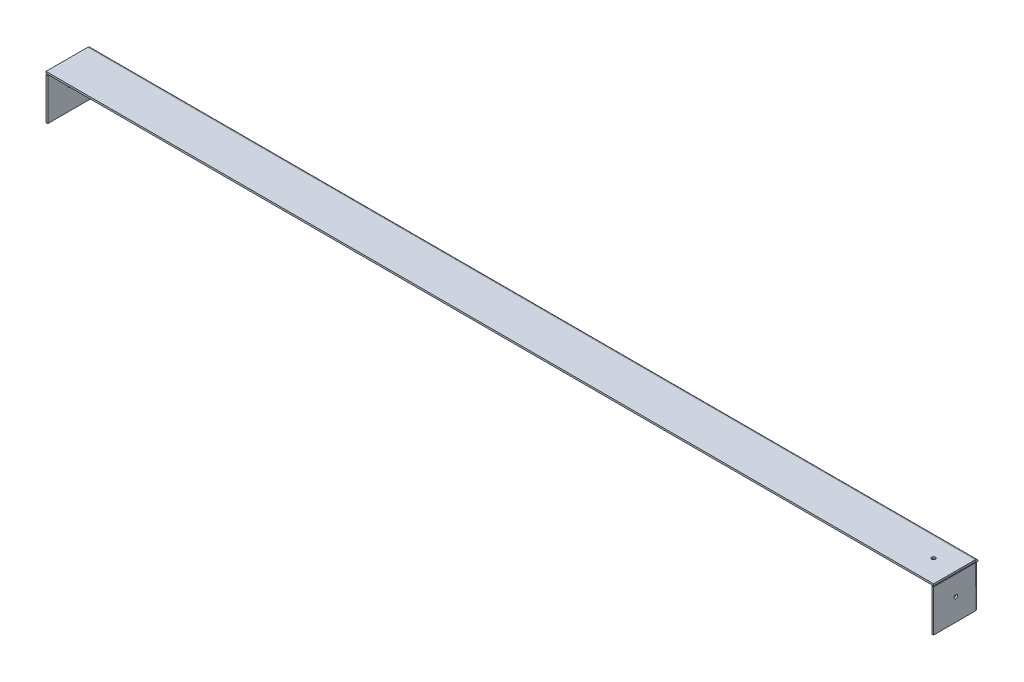
ISO-10303-21;
HEADER;
FILE_DESCRIPTION(('STEP AP214'),'2;1');
FILE_NAME('part.step','',(''),(''),'','','');
FILE_SCHEMA(('AUTOMOTIVE_DESIGN { 1 0 10303 214 1 1 1 1 }'));
ENDSEC;
DATA;
#1=APPLICATION_CONTEXT('core data for automotive mechanical design processes');
#2=APPLICATION_PROTOCOL_DEFINITION('international standard','automotive_design',2000,#1);
#3=PRODUCT_CONTEXT('',#1,'mechanical');
#4=PRODUCT('Part','Part','',(#3));
#5=PRODUCT_RELATED_PRODUCT_CATEGORY('part','',(#4));
#6=PRODUCT_DEFINITION_FORMATION('','',#4);
#7=PRODUCT_DEFINITION_CONTEXT('part definition',#1,'design');
#8=PRODUCT_DEFINITION('design','',#6,#7);
#9=PRODUCT_DEFINITION_SHAPE('','',#8);
#10=(LENGTH_UNIT() NAMED_UNIT(*) SI_UNIT(.MILLI.,.METRE.));
#11=(NAMED_UNIT(*) PLANE_ANGLE_UNIT() SI_UNIT($,.RADIAN.));
#12=(NAMED_UNIT(*) SI_UNIT($,.STERADIAN.) SOLID_ANGLE_UNIT());
#13=UNCERTAINTY_MEASURE_WITH_UNIT(LENGTH_MEASURE(1.E-05),#10,'distance_accuracy_value','');
#14=(GEOMETRIC_REPRESENTATION_CONTEXT(3) GLOBAL_UNCERTAINTY_ASSIGNED_CONTEXT((#13)) GLOBAL_UNIT_ASSIGNED_CONTEXT((#10,
#11,#12)) REPRESENTATION_CONTEXT('',''));
#15=CARTESIAN_POINT('',(0.,0.,0.));
#16=DIRECTION('',(0.,0.,1.));
#17=DIRECTION('',(1.,0.,0.));
#18=AXIS2_PLACEMENT_3D('',#15,#16,#17);
#19=CARTESIAN_POINT('',(500.,22.,2.));
#20=DIRECTION('',(0.,-1.,0.));
#21=DIRECTION('',(0.,0.,-1.));
#22=AXIS2_PLACEMENT_3D('',#19,#20,#21);
#23=PLANE('',#22);
#24=DIRECTION('',(-1.,0.,0.));
#25=VECTOR('',#24,1.);
#26=CARTESIAN_POINT('',(500.,22.,2.));
#27=LINE('',#26,#25);
#28=CARTESIAN_POINT('',(500.,22.,2.));
#29=VERTEX_POINT('',#28);
#30=CARTESIAN_POINT('',(499.828427124746,22.,2.));
#31=VERTEX_POINT('',#30);
#32=EDGE_CURVE('E345',#29,#31,#27,.T.);
#33=ORIENTED_EDGE('',*,*,#32,.T.);
#34=CARTESIAN_POINT('',(497.,22.,3.00000000000001));
#35=DIRECTION('',(0.,1.,0.));
#36=DIRECTION('',(0.,0.,1.));
#37=AXIS2_PLACEMENT_3D('',#34,#35,#36);
#38=CIRCLE('',#37,3.);
#39=CARTESIAN_POINT('',(497.,22.,0.));
#40=VERTEX_POINT('',#39);
#41=EDGE_CURVE('E13',#31,#40,#38,.T.);
#42=ORIENTED_EDGE('',*,*,#41,.T.);
#43=DIRECTION('',(-1.,0.,0.));
#44=VECTOR('',#43,1.);
#45=CARTESIAN_POINT('',(-500.,22.,0.));
#46=LINE('',#45,#44);
#47=CARTESIAN_POINT('',(500.,22.,0.));
#48=VERTEX_POINT('',#47);
#49=EDGE_CURVE('E347',#48,#40,#46,.T.);
#50=ORIENTED_EDGE('',*,*,#49,.F.);
#51=DIRECTION('',(0.,0.,-1.));
#52=VECTOR('',#51,1.);
#53=CARTESIAN_POINT('',(500.,22.,1.99999999999997));
#54=LINE('',#53,#52);
#55=EDGE_CURVE('E527',#29,#48,#54,.T.);
#56=ORIENTED_EDGE('',*,*,#55,.F.);
#57=EDGE_LOOP('',(#33,#42,#50,#56));
#58=FACE_BOUND('',#57,.T.);
#59=ADVANCED_FACE('F97',(#58),#23,.T.);
#60=CARTESIAN_POINT('',(0.,0.,2.));
#61=DIRECTION('',(0.,0.,1.));
#62=DIRECTION('',(1.,0.,0.));
#63=AXIS2_PLACEMENT_3D('',#60,#61,#62);
#64=PLANE('',#63);
#65=CARTESIAN_POINT('',(-481.5,0.,2.));
#66=DIRECTION('',(0.,0.,1.));
#67=DIRECTION('',(1.,0.,0.));
#68=AXIS2_PLACEMENT_3D('',#65,#66,#67);
#69=CIRCLE('',#68,4.25);
#70=CARTESIAN_POINT('',(-481.5,4.25,2.));
#71=VERTEX_POINT('',#70);
#72=CARTESIAN_POINT('',(-481.5,-4.25,2.));
#73=VERTEX_POINT('',#72);
#74=EDGE_CURVE('E404',#71,#73,#69,.T.);
#75=ORIENTED_EDGE('',*,*,#74,.F.);
#76=DIRECTION('',(-1.,0.,0.));
#77=VECTOR('',#76,1.);
#78=CARTESIAN_POINT('',(-481.5,4.25,2.));
#79=LINE('',#78,#77);
#80=CARTESIAN_POINT('',(-468.5,4.25,2.));
#81=VERTEX_POINT('',#80);
#82=EDGE_CURVE('E409',#81,#71,#79,.T.);
#83=ORIENTED_EDGE('',*,*,#82,.F.);
#84=CARTESIAN_POINT('',(-468.5,0.,2.));
#85=DIRECTION('',(0.,0.,1.));
#86=DIRECTION('',(1.,0.,0.));
#87=AXIS2_PLACEMENT_3D('',#84,#85,#86);
#88=CIRCLE('',#87,4.25);
#89=CARTESIAN_POINT('',(-468.5,-4.25,2.));
#90=VERTEX_POINT('',#89);
#91=EDGE_CURVE('E423',#90,#81,#88,.T.);
#92=ORIENTED_EDGE('',*,*,#91,.F.);
#93=DIRECTION('',(1.,0.,0.));
#94=VECTOR('',#93,1.);
#95=CARTESIAN_POINT('',(-481.5,-4.25,2.));
#96=LINE('',#95,#94);
#97=EDGE_CURVE('E420',#73,#90,#96,.T.);
#98=ORIENTED_EDGE('',*,*,#97,.F.);
#99=EDGE_LOOP('',(#75,#83,#92,#98));
#100=FACE_BOUND('',#99,.T.);
#101=CARTESIAN_POINT('',(468.5,0.,2.));
#102=DIRECTION('',(0.,0.,1.));
#103=DIRECTION('',(1.,0.,0.));
#104=AXIS2_PLACEMENT_3D('',#101,#102,#103);
#105=CIRCLE('',#104,4.25);
#106=CARTESIAN_POINT('',(468.5,4.25000000000001,2.));
#107=VERTEX_POINT('',#106);
#108=CARTESIAN_POINT('',(468.5,-4.24999999999999,2.));
#109=VERTEX_POINT('',#108);
#110=EDGE_CURVE('E430',#107,#109,#105,.T.);
#111=ORIENTED_EDGE('',*,*,#110,.F.);
#112=DIRECTION('',(-1.,0.,0.));
#113=VECTOR('',#112,1.);
#114=CARTESIAN_POINT('',(468.5,4.25000000000001,2.));
#115=LINE('',#114,#113);
#116=CARTESIAN_POINT('',(481.5,4.25000000000001,2.));
#117=VERTEX_POINT('',#116);
#118=EDGE_CURVE('E441',#117,#107,#115,.T.);
#119=ORIENTED_EDGE('',*,*,#118,.F.);
#120=CARTESIAN_POINT('',(481.5,0.,2.));
#121=DIRECTION('',(0.,0.,1.));
#122=DIRECTION('',(1.,0.,0.));
#123=AXIS2_PLACEMENT_3D('',#120,#121,#122);
#124=CIRCLE('',#123,4.25);
#125=CARTESIAN_POINT('',(481.5,-4.24999999999999,2.));
#126=VERTEX_POINT('',#125);
#127=EDGE_CURVE('E455',#126,#117,#124,.T.);
#128=ORIENTED_EDGE('',*,*,#127,.F.);
#129=DIRECTION('',(1.,0.,0.));
#130=VECTOR('',#129,1.);
#131=CARTESIAN_POINT('',(468.5,-4.24999999999999,2.));
#132=LINE('',#131,#130);
#133=EDGE_CURVE('E452',#109,#126,#132,.T.);
#134=ORIENTED_EDGE('',*,*,#133,.F.);
#135=EDGE_LOOP('',(#111,#119,#128,#134));
#136=FACE_BOUND('',#135,.T.);
#137=DIRECTION('',(1.,0.,0.));
#138=VECTOR('',#137,1.);
#139=CARTESIAN_POINT('',(-500.,-25.,2.));
#140=LINE('',#139,#138);
#141=CARTESIAN_POINT('',(-497.,-25.,2.00000000000001));
#142=VERTEX_POINT('',#141);
#143=CARTESIAN_POINT('',(497.,-25.,2.00000000000001));
#144=VERTEX_POINT('',#143);
#145=EDGE_CURVE('E106',#142,#144,#140,.T.);
#146=ORIENTED_EDGE('',*,*,#145,.T.);
#147=DIRECTION('',(0.,1.,0.));
#148=VECTOR('',#147,1.);
#149=CARTESIAN_POINT('',(497.,22.,2.00000000000001));
#150=LINE('',#149,#148);
#151=CARTESIAN_POINT('',(497.,22.,2.00000000000001));
#152=VERTEX_POINT('',#151);
#153=EDGE_CURVE('E339',#152,#144,#150,.F.);
#154=ORIENTED_EDGE('',*,*,#153,.F.);
#155=DIRECTION('',(-1.,0.,0.));
#156=VECTOR('',#155,1.);
#157=CARTESIAN_POINT('',(-500.,22.,1.99999999999997));
#158=LINE('',#157,#156);
#159=CARTESIAN_POINT('',(-497.,22.,1.99999999999997));
#160=VERTEX_POINT('',#159);
#161=EDGE_CURVE('E524',#160,#152,#158,.F.);
#162=ORIENTED_EDGE('',*,*,#161,.F.);
#163=DIRECTION('',(0.,-1.,0.));
#164=VECTOR('',#163,1.);
#165=CARTESIAN_POINT('',(-497.,-25.,2.00000000000001));
#166=LINE('',#165,#164);
#167=EDGE_CURVE('E398',#142,#160,#166,.F.);
#168=ORIENTED_EDGE('',*,*,#167,.F.);
#169=EDGE_LOOP('',(#146,#154,#162,#168));
#170=FACE_BOUND('',#169,.T.);
#171=ADVANCED_FACE('F590',(#100,#136,#170),#64,.T.);
#172=CARTESIAN_POINT('',(0.,0.,0.));
#173=DIRECTION('',(0.,0.,1.));
#174=DIRECTION('',(1.,0.,0.));
#175=AXIS2_PLACEMENT_3D('',#172,#173,#174);
#176=PLANE('',#175);
#177=DIRECTION('',(-1.,0.,0.));
#178=VECTOR('',#177,1.);
#179=CARTESIAN_POINT('',(-481.5,4.25,0.));
#180=LINE('',#179,#178);
#181=CARTESIAN_POINT('',(-468.5,4.25,0.));
#182=VERTEX_POINT('',#181);
#183=CARTESIAN_POINT('',(-481.5,4.25,0.));
#184=VERTEX_POINT('',#183);
#185=EDGE_CURVE('E415',#182,#184,#180,.T.);
#186=ORIENTED_EDGE('',*,*,#185,.T.);
#187=CARTESIAN_POINT('',(-481.5,0.,0.));
#188=DIRECTION('',(0.,0.,1.));
#189=DIRECTION('',(1.,0.,0.));
#190=AXIS2_PLACEMENT_3D('',#187,#188,#189);
#191=CIRCLE('',#190,4.25);
#192=CARTESIAN_POINT('',(-481.5,-4.25,0.));
#193=VERTEX_POINT('',#192);
#194=EDGE_CURVE('E405',#184,#193,#191,.T.);
#195=ORIENTED_EDGE('',*,*,#194,.T.);
#196=DIRECTION('',(1.,0.,0.));
#197=VECTOR('',#196,1.);
#198=CARTESIAN_POINT('',(-481.5,-4.25,0.));
#199=LINE('',#198,#197);
#200=CARTESIAN_POINT('',(-468.5,-4.25,0.));
#201=VERTEX_POINT('',#200);
#202=EDGE_CURVE('E408',#193,#201,#199,.T.);
#203=ORIENTED_EDGE('',*,*,#202,.T.);
#204=CARTESIAN_POINT('',(-468.5,0.,0.));
#205=DIRECTION('',(0.,0.,1.));
#206=DIRECTION('',(1.,0.,0.));
#207=AXIS2_PLACEMENT_3D('',#204,#205,#206);
#208=CIRCLE('',#207,4.25);
#209=EDGE_CURVE('E412',#201,#182,#208,.T.);
#210=ORIENTED_EDGE('',*,*,#209,.T.);
#211=EDGE_LOOP('',(#186,#195,#203,#210));
#212=FACE_BOUND('',#211,.T.);
#213=DIRECTION('',(-1.,0.,0.));
#214=VECTOR('',#213,1.);
#215=CARTESIAN_POINT('',(468.5,4.25000000000001,0.));
#216=LINE('',#215,#214);
#217=CARTESIAN_POINT('',(481.5,4.25000000000001,0.));
#218=VERTEX_POINT('',#217);
#219=CARTESIAN_POINT('',(468.5,4.25000000000001,0.));
#220=VERTEX_POINT('',#219);
#221=EDGE_CURVE('E447',#218,#220,#216,.T.);
#222=ORIENTED_EDGE('',*,*,#221,.T.);
#223=CARTESIAN_POINT('',(468.5,0.,0.));
#224=DIRECTION('',(0.,0.,1.));
#225=DIRECTION('',(1.,0.,0.));
#226=AXIS2_PLACEMENT_3D('',#223,#224,#225);
#227=CIRCLE('',#226,4.25);
#228=CARTESIAN_POINT('',(468.5,-4.24999999999999,0.));
#229=VERTEX_POINT('',#228);
#230=EDGE_CURVE('E437',#220,#229,#227,.T.);
#231=ORIENTED_EDGE('',*,*,#230,.T.);
#232=DIRECTION('',(1.,0.,0.));
#233=VECTOR('',#232,1.);
#234=CARTESIAN_POINT('',(468.5,-4.24999999999999,0.));
#235=LINE('',#234,#233);
#236=CARTESIAN_POINT('',(481.5,-4.24999999999999,0.));
#237=VERTEX_POINT('',#236);
#238=EDGE_CURVE('E440',#229,#237,#235,.T.);
#239=ORIENTED_EDGE('',*,*,#238,.T.);
#240=CARTESIAN_POINT('',(481.5,0.,0.));
#241=DIRECTION('',(0.,0.,1.));
#242=DIRECTION('',(1.,0.,0.));
#243=AXIS2_PLACEMENT_3D('',#240,#241,#242);
#244=CIRCLE('',#243,4.25);
#245=EDGE_CURVE('E444',#237,#218,#244,.T.);
#246=ORIENTED_EDGE('',*,*,#245,.T.);
#247=EDGE_LOOP('',(#222,#231,#239,#246));
#248=FACE_BOUND('',#247,.T.);
#249=DIRECTION('',(0.,1.,0.));
#250=VECTOR('',#249,1.);
#251=CARTESIAN_POINT('',(497.,22.,0.));
#252=LINE('',#251,#250);
#253=CARTESIAN_POINT('',(497.,-25.,0.));
#254=VERTEX_POINT('',#253);
#255=EDGE_CURVE('E287',#40,#254,#252,.F.);
#256=ORIENTED_EDGE('',*,*,#255,.T.);
#257=DIRECTION('',(1.,0.,0.));
#258=VECTOR('',#257,1.);
#259=CARTESIAN_POINT('',(-500.,-25.,0.));
#260=LINE('',#259,#258);
#261=CARTESIAN_POINT('',(-497.,-25.,0.));
#262=VERTEX_POINT('',#261);
#263=EDGE_CURVE('E530',#262,#254,#260,.T.);
#264=ORIENTED_EDGE('',*,*,#263,.F.);
#265=DIRECTION('',(0.,-1.,0.));
#266=VECTOR('',#265,1.);
#267=CARTESIAN_POINT('',(-497.,-25.,0.));
#268=LINE('',#267,#266);
#269=CARTESIAN_POINT('',(-497.,22.,0.));
#270=VERTEX_POINT('',#269);
#271=EDGE_CURVE('E386',#262,#270,#268,.F.);
#272=ORIENTED_EDGE('',*,*,#271,.T.);
#273=DIRECTION('',(-1.,0.,0.));
#274=VECTOR('',#273,1.);
#275=CARTESIAN_POINT('',(-500.,22.,0.));
#276=LINE('',#275,#274);
#277=EDGE_CURVE('E510',#270,#40,#276,.F.);
#278=ORIENTED_EDGE('',*,*,#277,.T.);
#279=EDGE_LOOP('',(#256,#264,#272,#278));
#280=FACE_BOUND('',#279,.T.);
#281=ADVANCED_FACE('F542',(#212,#248,#280),#176,.F.);
#282=CARTESIAN_POINT('',(-500.,-25.,2.));
#283=DIRECTION('',(0.,1.,0.));
#284=DIRECTION('',(0.,0.,1.));
#285=AXIS2_PLACEMENT_3D('',#282,#283,#284);
#286=PLANE('',#285);
#287=DIRECTION('',(0.,0.,-1.));
#288=VECTOR('',#287,1.);
#289=CARTESIAN_POINT('',(497.,-25.,2.00000000000001));
#290=LINE('',#289,#288);
#291=EDGE_CURVE('E335',#144,#254,#290,.T.);
#292=ORIENTED_EDGE('',*,*,#291,.F.);
#293=ORIENTED_EDGE('',*,*,#145,.F.);
#294=DIRECTION('',(0.,0.,-1.));
#295=VECTOR('',#294,1.);
#296=CARTESIAN_POINT('',(-497.,-25.,2.00000000000001));
#297=LINE('',#296,#295);
#298=EDGE_CURVE('E394',#142,#262,#297,.T.);
#299=ORIENTED_EDGE('',*,*,#298,.T.);
#300=ORIENTED_EDGE('',*,*,#263,.T.);
#301=EDGE_LOOP('',(#292,#293,#299,#300));
#302=FACE_BOUND('',#301,.T.);
#303=ADVANCED_FACE('F99',(#302),#286,.F.);
#304=CARTESIAN_POINT('',(-497.,22.,2.00000000000001));
#305=DIRECTION('',(0.,-1.,0.));
#306=DIRECTION('',(0.,0.,-1.));
#307=AXIS2_PLACEMENT_3D('',#304,#305,#306);
#308=PLANE('',#307);
#309=CARTESIAN_POINT('',(-500.,22.,0.));
#310=VERTEX_POINT('',#309);
#311=EDGE_CURVE('E506',#310,#270,#276,.F.);
#312=ORIENTED_EDGE('',*,*,#311,.T.);
#313=CARTESIAN_POINT('',(-497.,22.,3.00000000000001));
#314=DIRECTION('',(0.,-1.,0.));
#315=DIRECTION('',(0.,0.,-1.));
#316=AXIS2_PLACEMENT_3D('',#313,#314,#315);
#317=CIRCLE('',#316,3.);
#318=CARTESIAN_POINT('',(-499.828427124746,22.,1.99999999999997));
#319=VERTEX_POINT('',#318);
#320=EDGE_CURVE('E391',#270,#319,#317,.F.);
#321=ORIENTED_EDGE('',*,*,#320,.T.);
#322=CARTESIAN_POINT('',(-500.,22.,2.));
#323=VERTEX_POINT('',#322);
#324=EDGE_CURVE('E520',#323,#319,#158,.F.);
#325=ORIENTED_EDGE('',*,*,#324,.F.);
#326=DIRECTION('',(0.,0.,-1.));
#327=VECTOR('',#326,1.);
#328=CARTESIAN_POINT('',(-500.,22.,1.99999999999997));
#329=LINE('',#328,#327);
#330=EDGE_CURVE('E513',#323,#310,#329,.T.);
#331=ORIENTED_EDGE('',*,*,#330,.T.);
#332=EDGE_LOOP('',(#312,#321,#325,#331));
#333=FACE_BOUND('',#332,.T.);
#334=ADVANCED_FACE('F640',(#333),#308,.T.);
#335=CARTESIAN_POINT('',(500.,22.,2.99999999999997));
#336=DIRECTION('',(1.,0.,0.));
#337=DIRECTION('',(0.,0.,-1.));
#338=AXIS2_PLACEMENT_3D('',#335,#336,#337);
#339=PLANE('',#338);
#340=DIRECTION('',(0.,1.,0.));
#341=VECTOR('',#340,1.);
#342=CARTESIAN_POINT('',(500.,25.,2.99999999999999));
#343=LINE('',#342,#341);
#344=CARTESIAN_POINT('',(500.,23.,2.99999999999997));
#345=VERTEX_POINT('',#344);
#346=CARTESIAN_POINT('',(500.,25.,2.99999999999996));
#347=VERTEX_POINT('',#346);
#348=EDGE_CURVE('E472',#345,#347,#343,.T.);
#349=ORIENTED_EDGE('',*,*,#348,.F.);
#350=CARTESIAN_POINT('',(500.,22.,2.99999999999997));
#351=DIRECTION('',(-1.,0.,0.));
#352=DIRECTION('',(0.,0.,1.));
#353=AXIS2_PLACEMENT_3D('',#350,#351,#352);
#354=CIRCLE('',#353,1.);
#355=EDGE_CURVE('E517',#29,#345,#354,.F.);
#356=ORIENTED_EDGE('',*,*,#355,.F.);
#357=ORIENTED_EDGE('',*,*,#55,.T.);
#358=CARTESIAN_POINT('',(500.,22.,2.99999999999997));
#359=DIRECTION('',(-1.,0.,0.));
#360=DIRECTION('',(0.,0.,1.));
#361=AXIS2_PLACEMENT_3D('',#358,#359,#360);
#362=CIRCLE('',#361,3.);
#363=EDGE_CURVE('E509',#48,#347,#362,.F.);
#364=ORIENTED_EDGE('',*,*,#363,.T.);
#365=EDGE_LOOP('',(#349,#356,#357,#364));
#366=FACE_BOUND('',#365,.T.);
#367=ADVANCED_FACE('F551',(#366),#339,.T.);
#368=CARTESIAN_POINT('',(-500.,22.,2.99999999999997));
#369=DIRECTION('',(1.,0.,0.));
#370=DIRECTION('',(0.,0.,-1.));
#371=AXIS2_PLACEMENT_3D('',#368,#369,#370);
#372=PLANE('',#371);
#373=CARTESIAN_POINT('',(-500.,22.,2.99999999999997));
#374=DIRECTION('',(-1.,0.,0.));
#375=DIRECTION('',(0.,0.,1.));
#376=AXIS2_PLACEMENT_3D('',#373,#374,#375);
#377=CIRCLE('',#376,1.);
#378=CARTESIAN_POINT('',(-500.,23.,2.99999999999997));
#379=VERTEX_POINT('',#378);
#380=EDGE_CURVE('E477',#379,#323,#377,.T.);
#381=ORIENTED_EDGE('',*,*,#380,.F.);
#382=DIRECTION('',(0.,1.,0.));
#383=VECTOR('',#382,1.);
#384=CARTESIAN_POINT('',(-500.,23.,2.99999999999994));
#385=LINE('',#384,#383);
#386=CARTESIAN_POINT('',(-500.,25.,2.99999999999993));
#387=VERTEX_POINT('',#386);
#388=EDGE_CURVE('E499',#379,#387,#385,.T.);
#389=ORIENTED_EDGE('',*,*,#388,.T.);
#390=CARTESIAN_POINT('',(-500.,22.,2.99999999999997));
#391=DIRECTION('',(-1.,0.,0.));
#392=DIRECTION('',(0.,0.,1.));
#393=AXIS2_PLACEMENT_3D('',#390,#391,#392);
#394=CIRCLE('',#393,3.);
#395=EDGE_CURVE('E514',#387,#310,#394,.T.);
#396=ORIENTED_EDGE('',*,*,#395,.T.);
#397=ORIENTED_EDGE('',*,*,#330,.F.);
#398=EDGE_LOOP('',(#381,#389,#396,#397));
#399=FACE_BOUND('',#398,.T.);
#400=ADVANCED_FACE('F573',(#399),#372,.F.);
#401=CARTESIAN_POINT('',(-500.,22.,2.99999999999997));
#402=DIRECTION('',(-1.,0.,0.));
#403=DIRECTION('',(0.,1.,0.));
#404=AXIS2_PLACEMENT_3D('',#401,#402,#403);
#405=CYLINDRICAL_SURFACE('',#404,3.);
#406=ORIENTED_EDGE('',*,*,#311,.F.);
#407=ORIENTED_EDGE('',*,*,#395,.F.);
#408=DIRECTION('',(-1.,0.,0.));
#409=VECTOR('',#408,1.);
#410=CARTESIAN_POINT('',(500.,25.,2.99999999999999));
#411=LINE('',#410,#409);
#412=EDGE_CURVE('E497',#387,#347,#411,.F.);
#413=ORIENTED_EDGE('',*,*,#412,.T.);
#414=ORIENTED_EDGE('',*,*,#363,.F.);
#415=ORIENTED_EDGE('',*,*,#49,.T.);
#416=ORIENTED_EDGE('',*,*,#277,.F.);
#417=EDGE_LOOP('',(#406,#407,#413,#414,#415,#416));
#418=FACE_BOUND('',#417,.T.);
#419=ADVANCED_FACE('F546',(#418),#405,.T.);
#420=CARTESIAN_POINT('',(-500.,22.,2.99999999999997));
#421=DIRECTION('',(-1.,0.,0.));
#422=DIRECTION('',(0.,1.,0.));
#423=AXIS2_PLACEMENT_3D('',#420,#421,#422);
#424=CYLINDRICAL_SURFACE('',#423,1.);
#425=ORIENTED_EDGE('',*,*,#324,.T.);
#426=EDGE_CURVE('E523',#319,#160,#158,.F.);
#427=ORIENTED_EDGE('',*,*,#426,.T.);
#428=ORIENTED_EDGE('',*,*,#161,.T.);
#429=EDGE_CURVE('E115',#31,#152,#27,.T.);
#430=ORIENTED_EDGE('',*,*,#429,.F.);
#431=ORIENTED_EDGE('',*,*,#32,.F.);
#432=ORIENTED_EDGE('',*,*,#355,.T.);
#433=DIRECTION('',(-1.,0.,0.));
#434=VECTOR('',#433,1.);
#435=CARTESIAN_POINT('',(500.,23.,3.));
#436=LINE('',#435,#434);
#437=EDGE_CURVE('E502',#345,#379,#436,.T.);
#438=ORIENTED_EDGE('',*,*,#437,.T.);
#439=ORIENTED_EDGE('',*,*,#380,.T.);
#440=EDGE_LOOP('',(#425,#427,#428,#430,#431,#432,#438,#439));
#441=FACE_BOUND('',#440,.T.);
#442=ADVANCED_FACE('F553',(#441),#424,.F.);
#443=CARTESIAN_POINT('',(500.,25.,1.99999999999999));
#444=DIRECTION('',(1.,0.,0.));
#445=DIRECTION('',(0.,0.,-1.));
#446=AXIS2_PLACEMENT_3D('',#443,#444,#445);
#447=PLANE('',#446);
#448=DIRECTION('',(0.,0.,1.));
#449=VECTOR('',#448,1.);
#450=CARTESIAN_POINT('',(500.,23.,0.));
#451=LINE('',#450,#449);
#452=CARTESIAN_POINT('',(500.,23.0000000000002,50.));
#453=VERTEX_POINT('',#452);
#454=EDGE_CURVE('E495',#345,#453,#451,.T.);
#455=ORIENTED_EDGE('',*,*,#454,.F.);
#456=ORIENTED_EDGE('',*,*,#348,.T.);
#457=DIRECTION('',(0.,0.,-1.));
#458=VECTOR('',#457,1.);
#459=CARTESIAN_POINT('',(500.,25.,1.99999999999999));
#460=LINE('',#459,#458);
#461=CARTESIAN_POINT('',(500.,25.0000000000002,50.));
#462=VERTEX_POINT('',#461);
#463=EDGE_CURVE('E487',#347,#462,#460,.F.);
#464=ORIENTED_EDGE('',*,*,#463,.T.);
#465=DIRECTION('',(0.,-1.,0.));
#466=VECTOR('',#465,1.);
#467=CARTESIAN_POINT('',(500.,25.0000000000002,50.));
#468=LINE('',#467,#466);
#469=EDGE_CURVE('E478',#462,#453,#468,.T.);
#470=ORIENTED_EDGE('',*,*,#469,.T.);
#471=EDGE_LOOP('',(#455,#456,#464,#470));
#472=FACE_BOUND('',#471,.T.);
#473=ADVANCED_FACE('F560',(#472),#447,.T.);
#474=CARTESIAN_POINT('',(-500.,25.0000000000002,50.));
#475=DIRECTION('',(-1.,0.,0.));
#476=DIRECTION('',(0.,0.,1.));
#477=AXIS2_PLACEMENT_3D('',#474,#475,#476);
#478=PLANE('',#477);
#479=DIRECTION('',(0.,0.,1.));
#480=VECTOR('',#479,1.);
#481=CARTESIAN_POINT('',(-500.,25.0000000000002,50.));
#482=LINE('',#481,#480);
#483=CARTESIAN_POINT('',(-500.,25.0000000000002,50.));
#484=VERTEX_POINT('',#483);
#485=EDGE_CURVE('E481',#484,#387,#482,.F.);
#486=ORIENTED_EDGE('',*,*,#485,.T.);
#487=ORIENTED_EDGE('',*,*,#388,.F.);
#488=DIRECTION('',(0.,0.,-1.));
#489=VECTOR('',#488,1.);
#490=CARTESIAN_POINT('',(-500.,23.,0.));
#491=LINE('',#490,#489);
#492=CARTESIAN_POINT('',(-500.,23.0000000000002,50.));
#493=VERTEX_POINT('',#492);
#494=EDGE_CURVE('E489',#493,#379,#491,.T.);
#495=ORIENTED_EDGE('',*,*,#494,.F.);
#496=DIRECTION('',(0.,-1.,0.));
#497=VECTOR('',#496,1.);
#498=CARTESIAN_POINT('',(-500.,25.0000000000002,50.));
#499=LINE('',#498,#497);
#500=EDGE_CURVE('E475',#484,#493,#499,.T.);
#501=ORIENTED_EDGE('',*,*,#500,.F.);
#502=EDGE_LOOP('',(#486,#487,#495,#501));
#503=FACE_BOUND('',#502,.T.);
#504=ADVANCED_FACE('F570',(#503),#478,.T.);
#505=CARTESIAN_POINT('',(0.,25.,0.));
#506=DIRECTION('',(0.,-1.,0.));
#507=DIRECTION('',(0.,0.,-1.));
#508=AXIS2_PLACEMENT_3D('',#505,#506,#507);
#509=PLANE('',#508);
#510=CARTESIAN_POINT('',(475.,25.0000000000001,25.));
#511=DIRECTION('',(0.,1.,0.));
#512=DIRECTION('',(0.,0.,1.));
#513=AXIS2_PLACEMENT_3D('',#510,#511,#512);
#514=CIRCLE('',#513,2.09999999999999);
#515=CARTESIAN_POINT('',(475.,25.0000000000001,27.1));
#516=VERTEX_POINT('',#515);
#517=EDGE_CURVE('E462',#516,#516,#514,.T.);
#518=ORIENTED_EDGE('',*,*,#517,.F.);
#519=EDGE_LOOP('',(#518));
#520=FACE_BOUND('',#519,.T.);
#521=ORIENTED_EDGE('',*,*,#412,.F.);
#522=ORIENTED_EDGE('',*,*,#485,.F.);
#523=DIRECTION('',(1.,0.,0.));
#524=VECTOR('',#523,1.);
#525=CARTESIAN_POINT('',(500.,25.0000000000002,50.));
#526=LINE('',#525,#524);
#527=EDGE_CURVE('E484',#462,#484,#526,.F.);
#528=ORIENTED_EDGE('',*,*,#527,.F.);
#529=ORIENTED_EDGE('',*,*,#463,.F.);
#530=EDGE_LOOP('',(#521,#522,#528,#529));
#531=FACE_BOUND('',#530,.T.);
#532=ADVANCED_FACE('F576',(#520,#531),#509,.F.);
#533=CARTESIAN_POINT('',(0.,23.,0.));
#534=DIRECTION('',(0.,-1.,0.));
#535=DIRECTION('',(0.,0.,-1.));
#536=AXIS2_PLACEMENT_3D('',#533,#534,#535);
#537=PLANE('',#536);
#538=CARTESIAN_POINT('',(475.,23.0000000000001,25.));
#539=DIRECTION('',(0.,1.,0.));
#540=DIRECTION('',(0.,0.,1.));
#541=AXIS2_PLACEMENT_3D('',#538,#539,#540);
#542=CIRCLE('',#541,2.09999999999999);
#543=CARTESIAN_POINT('',(475.,23.0000000000001,27.1));
#544=VERTEX_POINT('',#543);
#545=EDGE_CURVE('E469',#544,#544,#542,.T.);
#546=ORIENTED_EDGE('',*,*,#545,.T.);
#547=EDGE_LOOP('',(#546));
#548=FACE_BOUND('',#547,.T.);
#549=ORIENTED_EDGE('',*,*,#494,.T.);
#550=ORIENTED_EDGE('',*,*,#437,.F.);
#551=ORIENTED_EDGE('',*,*,#454,.T.);
#552=DIRECTION('',(-1.,0.,0.));
#553=VECTOR('',#552,1.);
#554=CARTESIAN_POINT('',(0.,23.0000000000002,50.));
#555=LINE('',#554,#553);
#556=EDGE_CURVE('E492',#453,#493,#555,.T.);
#557=ORIENTED_EDGE('',*,*,#556,.T.);
#558=EDGE_LOOP('',(#549,#550,#551,#557));
#559=FACE_BOUND('',#558,.T.);
#560=ADVANCED_FACE('F557',(#548,#559),#537,.T.);
#561=CARTESIAN_POINT('',(500.,25.0000000000002,50.));
#562=DIRECTION('',(0.,0.,1.));
#563=DIRECTION('',(0.,-1.,0.));
#564=AXIS2_PLACEMENT_3D('',#561,#562,#563);
#565=PLANE('',#564);
#566=ORIENTED_EDGE('',*,*,#556,.F.);
#567=ORIENTED_EDGE('',*,*,#469,.F.);
#568=ORIENTED_EDGE('',*,*,#527,.T.);
#569=ORIENTED_EDGE('',*,*,#500,.T.);
#570=EDGE_LOOP('',(#566,#567,#568,#569));
#571=FACE_BOUND('',#570,.T.);
#572=ADVANCED_FACE('F566',(#571),#565,.T.);
#573=CARTESIAN_POINT('',(475.,23.0000000000001,25.));
#574=DIRECTION('',(0.,1.,0.));
#575=DIRECTION('',(0.,0.,1.));
#576=AXIS2_PLACEMENT_3D('',#573,#574,#575);
#577=CYLINDRICAL_SURFACE('',#576,2.09999999999999);
#578=ORIENTED_EDGE('',*,*,#545,.F.);
#579=EDGE_LOOP('',(#578));
#580=FACE_BOUND('',#579,.T.);
#581=ORIENTED_EDGE('',*,*,#517,.T.);
#582=EDGE_LOOP('',(#581));
#583=FACE_BOUND('',#582,.T.);
#584=ADVANCED_FACE('F673',(#580,#583),#577,.F.);
#585=CARTESIAN_POINT('',(468.5,0.,0.));
#586=DIRECTION('',(0.,0.,1.));
#587=DIRECTION('',(1.,0.,0.));
#588=AXIS2_PLACEMENT_3D('',#585,#586,#587);
#589=CYLINDRICAL_SURFACE('',#588,4.25);
#590=ORIENTED_EDGE('',*,*,#110,.T.);
#591=DIRECTION('',(0.,0.,1.));
#592=VECTOR('',#591,1.);
#593=CARTESIAN_POINT('',(468.5,-4.24999999999999,0.));
#594=LINE('',#593,#592);
#595=EDGE_CURVE('E450',#229,#109,#594,.T.);
#596=ORIENTED_EDGE('',*,*,#595,.F.);
#597=ORIENTED_EDGE('',*,*,#230,.F.);
#598=DIRECTION('',(0.,0.,1.));
#599=VECTOR('',#598,1.);
#600=CARTESIAN_POINT('',(468.5,4.25000000000001,0.));
#601=LINE('',#600,#599);
#602=EDGE_CURVE('E460',#220,#107,#601,.T.);
#603=ORIENTED_EDGE('',*,*,#602,.T.);
#604=EDGE_LOOP('',(#590,#596,#597,#603));
#605=FACE_BOUND('',#604,.T.);
#606=ADVANCED_FACE('F664',(#605),#589,.F.);
#607=CARTESIAN_POINT('',(468.5,4.25000000000001,0.));
#608=DIRECTION('',(0.,1.,0.));
#609=DIRECTION('',(-1.,0.,0.));
#610=AXIS2_PLACEMENT_3D('',#607,#608,#609);
#611=PLANE('',#610);
#612=ORIENTED_EDGE('',*,*,#118,.T.);
#613=ORIENTED_EDGE('',*,*,#602,.F.);
#614=ORIENTED_EDGE('',*,*,#221,.F.);
#615=DIRECTION('',(0.,0.,1.));
#616=VECTOR('',#615,1.);
#617=CARTESIAN_POINT('',(481.5,4.25000000000001,0.));
#618=LINE('',#617,#616);
#619=EDGE_CURVE('E463',#218,#117,#618,.T.);
#620=ORIENTED_EDGE('',*,*,#619,.T.);
#621=EDGE_LOOP('',(#612,#613,#614,#620));
#622=FACE_BOUND('',#621,.T.);
#623=ADVANCED_FACE('F660',(#622),#611,.F.);
#624=CARTESIAN_POINT('',(481.5,0.,0.));
#625=DIRECTION('',(0.,0.,1.));
#626=DIRECTION('',(1.,0.,0.));
#627=AXIS2_PLACEMENT_3D('',#624,#625,#626);
#628=CYLINDRICAL_SURFACE('',#627,4.25);
#629=ORIENTED_EDGE('',*,*,#127,.T.);
#630=ORIENTED_EDGE('',*,*,#619,.F.);
#631=ORIENTED_EDGE('',*,*,#245,.F.);
#632=DIRECTION('',(0.,0.,1.));
#633=VECTOR('',#632,1.);
#634=CARTESIAN_POINT('',(481.5,-4.24999999999999,0.));
#635=LINE('',#634,#633);
#636=EDGE_CURVE('E465',#237,#126,#635,.T.);
#637=ORIENTED_EDGE('',*,*,#636,.T.);
#638=EDGE_LOOP('',(#629,#630,#631,#637));
#639=FACE_BOUND('',#638,.T.);
#640=ADVANCED_FACE('F663',(#639),#628,.F.);
#641=CARTESIAN_POINT('',(468.5,-4.24999999999999,0.));
#642=DIRECTION('',(0.,-1.,0.));
#643=DIRECTION('',(1.,0.,0.));
#644=AXIS2_PLACEMENT_3D('',#641,#642,#643);
#645=PLANE('',#644);
#646=ORIENTED_EDGE('',*,*,#133,.T.);
#647=ORIENTED_EDGE('',*,*,#636,.F.);
#648=ORIENTED_EDGE('',*,*,#238,.F.);
#649=ORIENTED_EDGE('',*,*,#595,.T.);
#650=EDGE_LOOP('',(#646,#647,#648,#649));
#651=FACE_BOUND('',#650,.T.);
#652=ADVANCED_FACE('F658',(#651),#645,.F.);
#653=CARTESIAN_POINT('',(-481.5,0.,0.));
#654=DIRECTION('',(0.,0.,1.));
#655=DIRECTION('',(1.,0.,0.));
#656=AXIS2_PLACEMENT_3D('',#653,#654,#655);
#657=CYLINDRICAL_SURFACE('',#656,4.25);
#658=ORIENTED_EDGE('',*,*,#74,.T.);
#659=DIRECTION('',(0.,0.,1.));
#660=VECTOR('',#659,1.);
#661=CARTESIAN_POINT('',(-481.5,-4.25,0.));
#662=LINE('',#661,#660);
#663=EDGE_CURVE('E418',#193,#73,#662,.T.);
#664=ORIENTED_EDGE('',*,*,#663,.F.);
#665=ORIENTED_EDGE('',*,*,#194,.F.);
#666=DIRECTION('',(0.,0.,1.));
#667=VECTOR('',#666,1.);
#668=CARTESIAN_POINT('',(-481.5,4.25,0.));
#669=LINE('',#668,#667);
#670=EDGE_CURVE('E428',#184,#71,#669,.T.);
#671=ORIENTED_EDGE('',*,*,#670,.T.);
#672=EDGE_LOOP('',(#658,#664,#665,#671));
#673=FACE_BOUND('',#672,.T.);
#674=ADVANCED_FACE('F648',(#673),#657,.F.);
#675=CARTESIAN_POINT('',(-481.5,4.25,0.));
#676=DIRECTION('',(0.,1.,0.));
#677=DIRECTION('',(-1.,0.,0.));
#678=AXIS2_PLACEMENT_3D('',#675,#676,#677);
#679=PLANE('',#678);
#680=ORIENTED_EDGE('',*,*,#82,.T.);
#681=ORIENTED_EDGE('',*,*,#670,.F.);
#682=ORIENTED_EDGE('',*,*,#185,.F.);
#683=DIRECTION('',(0.,0.,1.));
#684=VECTOR('',#683,1.);
#685=CARTESIAN_POINT('',(-468.5,4.25,0.));
#686=LINE('',#685,#684);
#687=EDGE_CURVE('E431',#182,#81,#686,.T.);
#688=ORIENTED_EDGE('',*,*,#687,.T.);
#689=EDGE_LOOP('',(#680,#681,#682,#688));
#690=FACE_BOUND('',#689,.T.);
#691=ADVANCED_FACE('F644',(#690),#679,.F.);
#692=CARTESIAN_POINT('',(-468.5,0.,0.));
#693=DIRECTION('',(0.,0.,1.));
#694=DIRECTION('',(1.,0.,0.));
#695=AXIS2_PLACEMENT_3D('',#692,#693,#694);
#696=CYLINDRICAL_SURFACE('',#695,4.25);
#697=ORIENTED_EDGE('',*,*,#91,.T.);
#698=ORIENTED_EDGE('',*,*,#687,.F.);
#699=ORIENTED_EDGE('',*,*,#209,.F.);
#700=DIRECTION('',(0.,0.,1.));
#701=VECTOR('',#700,1.);
#702=CARTESIAN_POINT('',(-468.5,-4.25,0.));
#703=LINE('',#702,#701);
#704=EDGE_CURVE('E433',#201,#90,#703,.T.);
#705=ORIENTED_EDGE('',*,*,#704,.T.);
#706=EDGE_LOOP('',(#697,#698,#699,#705));
#707=FACE_BOUND('',#706,.T.);
#708=ADVANCED_FACE('F647',(#707),#696,.F.);
#709=CARTESIAN_POINT('',(-481.5,-4.25,0.));
#710=DIRECTION('',(0.,-1.,0.));
#711=DIRECTION('',(1.,0.,0.));
#712=AXIS2_PLACEMENT_3D('',#709,#710,#711);
#713=PLANE('',#712);
#714=ORIENTED_EDGE('',*,*,#97,.T.);
#715=ORIENTED_EDGE('',*,*,#704,.F.);
#716=ORIENTED_EDGE('',*,*,#202,.F.);
#717=ORIENTED_EDGE('',*,*,#663,.T.);
#718=EDGE_LOOP('',(#714,#715,#716,#717));
#719=FACE_BOUND('',#718,.T.);
#720=ADVANCED_FACE('F636',(#719),#713,.F.);
#721=CARTESIAN_POINT('',(-497.,22.,3.00000000000001));
#722=DIRECTION('',(0.,1.,0.));
#723=DIRECTION('',(0.,0.,1.));
#724=AXIS2_PLACEMENT_3D('',#721,#722,#723);
#725=PLANE('',#724);
#726=ORIENTED_EDGE('',*,*,#426,.F.);
#727=CARTESIAN_POINT('',(-500.,22.,2.99999999999999));
#728=VERTEX_POINT('',#727);
#729=EDGE_CURVE('E389',#319,#728,#317,.F.);
#730=ORIENTED_EDGE('',*,*,#729,.T.);
#731=DIRECTION('',(-1.,0.,0.));
#732=VECTOR('',#731,1.);
#733=CARTESIAN_POINT('',(-500.,22.,2.99999999999999));
#734=LINE('',#733,#732);
#735=CARTESIAN_POINT('',(-498.,22.,3.));
#736=VERTEX_POINT('',#735);
#737=EDGE_CURVE('E383',#736,#728,#734,.T.);
#738=ORIENTED_EDGE('',*,*,#737,.F.);
#739=CARTESIAN_POINT('',(-497.,22.,3.00000000000001));
#740=DIRECTION('',(0.,-1.,0.));
#741=DIRECTION('',(0.,0.,-1.));
#742=AXIS2_PLACEMENT_3D('',#739,#740,#741);
#743=CIRCLE('',#742,1.);
#744=EDGE_CURVE('E123',#160,#736,#743,.F.);
#745=ORIENTED_EDGE('',*,*,#744,.F.);
#746=EDGE_LOOP('',(#726,#730,#738,#745));
#747=FACE_BOUND('',#746,.T.);
#748=ADVANCED_FACE('F633',(#747),#725,.T.);
#749=CARTESIAN_POINT('',(-497.,-25.,3.00000000000001));
#750=DIRECTION('',(0.,1.,0.));
#751=DIRECTION('',(0.,0.,1.));
#752=AXIS2_PLACEMENT_3D('',#749,#750,#751);
#753=PLANE('',#752);
#754=CARTESIAN_POINT('',(-497.,-25.,3.00000000000001));
#755=DIRECTION('',(0.,-1.,0.));
#756=DIRECTION('',(0.,0.,-1.));
#757=AXIS2_PLACEMENT_3D('',#754,#755,#756);
#758=CIRCLE('',#757,1.);
#759=CARTESIAN_POINT('',(-498.,-25.,3.));
#760=VERTEX_POINT('',#759);
#761=EDGE_CURVE('E355',#760,#142,#758,.T.);
#762=ORIENTED_EDGE('',*,*,#761,.F.);
#763=DIRECTION('',(-1.,0.,0.));
#764=VECTOR('',#763,1.);
#765=CARTESIAN_POINT('',(-498.,-25.,3.));
#766=LINE('',#765,#764);
#767=CARTESIAN_POINT('',(-500.,-25.,2.99999999999999));
#768=VERTEX_POINT('',#767);
#769=EDGE_CURVE('E378',#760,#768,#766,.T.);
#770=ORIENTED_EDGE('',*,*,#769,.T.);
#771=CARTESIAN_POINT('',(-497.,-25.,3.00000000000001));
#772=DIRECTION('',(0.,-1.,0.));
#773=DIRECTION('',(0.,0.,-1.));
#774=AXIS2_PLACEMENT_3D('',#771,#772,#773);
#775=CIRCLE('',#774,3.);
#776=EDGE_CURVE('E390',#768,#262,#775,.T.);
#777=ORIENTED_EDGE('',*,*,#776,.T.);
#778=ORIENTED_EDGE('',*,*,#298,.F.);
#779=EDGE_LOOP('',(#762,#770,#777,#778));
#780=FACE_BOUND('',#779,.T.);
#781=ADVANCED_FACE('F628',(#780),#753,.F.);
#782=CARTESIAN_POINT('',(-497.,-25.,3.00000000000001));
#783=DIRECTION('',(0.,-1.,0.));
#784=DIRECTION('',(-1.,0.,0.));
#785=AXIS2_PLACEMENT_3D('',#782,#783,#784);
#786=CYLINDRICAL_SURFACE('',#785,3.);
#787=ORIENTED_EDGE('',*,*,#271,.F.);
#788=ORIENTED_EDGE('',*,*,#776,.F.);
#789=DIRECTION('',(0.,-1.,0.));
#790=VECTOR('',#789,1.);
#791=CARTESIAN_POINT('',(-500.,22.,2.99999999999999));
#792=LINE('',#791,#790);
#793=EDGE_CURVE('E375',#768,#728,#792,.F.);
#794=ORIENTED_EDGE('',*,*,#793,.T.);
#795=ORIENTED_EDGE('',*,*,#729,.F.);
#796=ORIENTED_EDGE('',*,*,#320,.F.);
#797=EDGE_LOOP('',(#787,#788,#794,#795,#796));
#798=FACE_BOUND('',#797,.T.);
#799=ADVANCED_FACE('F625',(#798),#786,.T.);
#800=CARTESIAN_POINT('',(-497.,-25.,3.00000000000001));
#801=DIRECTION('',(0.,-1.,0.));
#802=DIRECTION('',(-1.,0.,0.));
#803=AXIS2_PLACEMENT_3D('',#800,#801,#802);
#804=CYLINDRICAL_SURFACE('',#803,1.);
#805=ORIENTED_EDGE('',*,*,#167,.T.);
#806=ORIENTED_EDGE('',*,*,#744,.T.);
#807=DIRECTION('',(0.,-1.,0.));
#808=VECTOR('',#807,1.);
#809=CARTESIAN_POINT('',(-498.,22.,3.));
#810=LINE('',#809,#808);
#811=EDGE_CURVE('E381',#736,#760,#810,.T.);
#812=ORIENTED_EDGE('',*,*,#811,.T.);
#813=ORIENTED_EDGE('',*,*,#761,.T.);
#814=EDGE_LOOP('',(#805,#806,#812,#813));
#815=FACE_BOUND('',#814,.T.);
#816=ADVANCED_FACE('F623',(#815),#804,.F.);
#817=CARTESIAN_POINT('',(-500.,22.,1.99999999999999));
#818=DIRECTION('',(0.,1.,0.));
#819=DIRECTION('',(0.,0.,1.));
#820=AXIS2_PLACEMENT_3D('',#817,#818,#819);
#821=PLANE('',#820);
#822=DIRECTION('',(0.,0.,1.));
#823=VECTOR('',#822,1.);
#824=CARTESIAN_POINT('',(-498.,22.,-2.31296463463574E-12));
#825=LINE('',#824,#823);
#826=CARTESIAN_POINT('',(-498.,22.,50.));
#827=VERTEX_POINT('',#826);
#828=EDGE_CURVE('E373',#736,#827,#825,.T.);
#829=ORIENTED_EDGE('',*,*,#828,.F.);
#830=ORIENTED_EDGE('',*,*,#737,.T.);
#831=DIRECTION('',(0.,0.,-1.));
#832=VECTOR('',#831,1.);
#833=CARTESIAN_POINT('',(-500.,22.,1.99999999999999));
#834=LINE('',#833,#832);
#835=CARTESIAN_POINT('',(-500.,22.,50.));
#836=VERTEX_POINT('',#835);
#837=EDGE_CURVE('E365',#728,#836,#834,.F.);
#838=ORIENTED_EDGE('',*,*,#837,.T.);
#839=DIRECTION('',(1.,0.,0.));
#840=VECTOR('',#839,1.);
#841=CARTESIAN_POINT('',(-500.,22.,50.));
#842=LINE('',#841,#840);
#843=EDGE_CURVE('E356',#836,#827,#842,.T.);
#844=ORIENTED_EDGE('',*,*,#843,.T.);
#845=EDGE_LOOP('',(#829,#830,#838,#844));
#846=FACE_BOUND('',#845,.T.);
#847=ADVANCED_FACE('F616',(#846),#821,.T.);
#848=CARTESIAN_POINT('',(-500.,-25.,50.));
#849=DIRECTION('',(0.,-1.,0.));
#850=DIRECTION('',(0.,0.,-1.));
#851=AXIS2_PLACEMENT_3D('',#848,#849,#850);
#852=PLANE('',#851);
#853=DIRECTION('',(0.,0.,1.));
#854=VECTOR('',#853,1.);
#855=CARTESIAN_POINT('',(-500.,-25.,50.));
#856=LINE('',#855,#854);
#857=CARTESIAN_POINT('',(-500.,-25.,50.));
#858=VERTEX_POINT('',#857);
#859=EDGE_CURVE('E359',#858,#768,#856,.F.);
#860=ORIENTED_EDGE('',*,*,#859,.T.);
#861=ORIENTED_EDGE('',*,*,#769,.F.);
#862=DIRECTION('',(0.,0.,-1.));
#863=VECTOR('',#862,1.);
#864=CARTESIAN_POINT('',(-498.,-25.,-2.31296463463574E-12));
#865=LINE('',#864,#863);
#866=CARTESIAN_POINT('',(-498.,-25.,50.));
#867=VERTEX_POINT('',#866);
#868=EDGE_CURVE('E367',#867,#760,#865,.T.);
#869=ORIENTED_EDGE('',*,*,#868,.F.);
#870=DIRECTION('',(1.,0.,0.));
#871=VECTOR('',#870,1.);
#872=CARTESIAN_POINT('',(-500.,-25.,50.));
#873=LINE('',#872,#871);
#874=EDGE_CURVE('E353',#858,#867,#873,.T.);
#875=ORIENTED_EDGE('',*,*,#874,.F.);
#876=EDGE_LOOP('',(#860,#861,#869,#875));
#877=FACE_BOUND('',#876,.T.);
#878=ADVANCED_FACE('F609',(#877),#852,.T.);
#879=CARTESIAN_POINT('',(-500.,0.,-2.31994759731343E-12));
#880=DIRECTION('',(1.,0.,0.));
#881=DIRECTION('',(0.,0.,-1.));
#882=AXIS2_PLACEMENT_3D('',#879,#880,#881);
#883=PLANE('',#882);
#884=CARTESIAN_POINT('',(-500.,0.,25.));
#885=DIRECTION('',(-1.,0.,0.));
#886=DIRECTION('',(0.,0.,1.));
#887=AXIS2_PLACEMENT_3D('',#884,#885,#886);
#888=CIRCLE('',#887,2.1);
#889=CARTESIAN_POINT('',(-500.,0.,27.1));
#890=VERTEX_POINT('',#889);
#891=EDGE_CURVE('E350',#890,#890,#888,.T.);
#892=ORIENTED_EDGE('',*,*,#891,.F.);
#893=EDGE_LOOP('',(#892));
#894=FACE_BOUND('',#893,.T.);
#895=ORIENTED_EDGE('',*,*,#793,.F.);
#896=ORIENTED_EDGE('',*,*,#859,.F.);
#897=DIRECTION('',(0.,1.,0.));
#898=VECTOR('',#897,1.);
#899=CARTESIAN_POINT('',(-500.,22.,50.));
#900=LINE('',#899,#898);
#901=EDGE_CURVE('E362',#836,#858,#900,.F.);
#902=ORIENTED_EDGE('',*,*,#901,.F.);
#903=ORIENTED_EDGE('',*,*,#837,.F.);
#904=EDGE_LOOP('',(#895,#896,#902,#903));
#905=FACE_BOUND('',#904,.T.);
#906=ADVANCED_FACE('F605',(#894,#905),#883,.F.);
#907=CARTESIAN_POINT('',(-498.,0.,-2.31296463463574E-12));
#908=DIRECTION('',(1.,0.,0.));
#909=DIRECTION('',(0.,0.,-1.));
#910=AXIS2_PLACEMENT_3D('',#907,#908,#909);
#911=PLANE('',#910);
#912=CARTESIAN_POINT('',(-498.,0.,25.));
#913=DIRECTION('',(1.,0.,0.));
#914=DIRECTION('',(0.,0.,-1.));
#915=AXIS2_PLACEMENT_3D('',#912,#913,#914);
#916=CIRCLE('',#915,2.1);
#917=CARTESIAN_POINT('',(-498.,0.,22.9));
#918=VERTEX_POINT('',#917);
#919=EDGE_CURVE('E101',#918,#918,#916,.T.);
#920=ORIENTED_EDGE('',*,*,#919,.F.);
#921=EDGE_LOOP('',(#920));
#922=FACE_BOUND('',#921,.T.);
#923=ORIENTED_EDGE('',*,*,#868,.T.);
#924=ORIENTED_EDGE('',*,*,#811,.F.);
#925=ORIENTED_EDGE('',*,*,#828,.T.);
#926=DIRECTION('',(0.,-1.,0.));
#927=VECTOR('',#926,1.);
#928=CARTESIAN_POINT('',(-498.,0.,50.));
#929=LINE('',#928,#927);
#930=EDGE_CURVE('E370',#827,#867,#929,.T.);
#931=ORIENTED_EDGE('',*,*,#930,.T.);
#932=EDGE_LOOP('',(#923,#924,#925,#931));
#933=FACE_BOUND('',#932,.T.);
#934=ADVANCED_FACE('F608',(#922,#933),#911,.T.);
#935=CARTESIAN_POINT('',(-500.,22.,50.));
#936=DIRECTION('',(0.,0.,1.));
#937=DIRECTION('',(1.,0.,0.));
#938=AXIS2_PLACEMENT_3D('',#935,#936,#937);
#939=PLANE('',#938);
#940=ORIENTED_EDGE('',*,*,#930,.F.);
#941=ORIENTED_EDGE('',*,*,#843,.F.);
#942=ORIENTED_EDGE('',*,*,#901,.T.);
#943=ORIENTED_EDGE('',*,*,#874,.T.);
#944=EDGE_LOOP('',(#940,#941,#942,#943));
#945=FACE_BOUND('',#944,.T.);
#946=ADVANCED_FACE('F603',(#945),#939,.T.);
#947=CARTESIAN_POINT('',(500.,0.,25.0000000000046));
#948=DIRECTION('',(-1.,0.,0.));
#949=DIRECTION('',(0.,0.,1.));
#950=AXIS2_PLACEMENT_3D('',#947,#948,#949);
#951=CYLINDRICAL_SURFACE('',#950,2.1);
#952=ORIENTED_EDGE('',*,*,#919,.T.);
#953=EDGE_LOOP('',(#952));
#954=FACE_BOUND('',#953,.T.);
#955=ORIENTED_EDGE('',*,*,#891,.T.);
#956=EDGE_LOOP('',(#955));
#957=FACE_BOUND('',#956,.T.);
#958=ADVANCED_FACE('F600',(#954,#957),#951,.F.);
#959=CARTESIAN_POINT('',(497.,-25.,3.00000000000001));
#960=DIRECTION('',(0.,-1.,0.));
#961=DIRECTION('',(0.,0.,-1.));
#962=AXIS2_PLACEMENT_3D('',#959,#960,#961);
#963=PLANE('',#962);
#964=DIRECTION('',(1.,0.,0.));
#965=VECTOR('',#964,1.);
#966=CARTESIAN_POINT('',(500.,-25.,3.));
#967=LINE('',#966,#965);
#968=CARTESIAN_POINT('',(498.,-25.,3.));
#969=VERTEX_POINT('',#968);
#970=CARTESIAN_POINT('',(500.,-25.,2.99999999999999));
#971=VERTEX_POINT('',#970);
#972=EDGE_CURVE('E329',#969,#971,#967,.T.);
#973=ORIENTED_EDGE('',*,*,#972,.F.);
#974=CARTESIAN_POINT('',(497.,-25.,3.00000000000001));
#975=DIRECTION('',(0.,1.,0.));
#976=DIRECTION('',(0.,0.,1.));
#977=AXIS2_PLACEMENT_3D('',#974,#975,#976);
#978=CIRCLE('',#977,1.);
#979=EDGE_CURVE('E288',#144,#969,#978,.F.);
#980=ORIENTED_EDGE('',*,*,#979,.F.);
#981=ORIENTED_EDGE('',*,*,#291,.T.);
#982=CARTESIAN_POINT('',(497.,-25.,3.00000000000001));
#983=DIRECTION('',(0.,1.,0.));
#984=DIRECTION('',(0.,0.,1.));
#985=AXIS2_PLACEMENT_3D('',#982,#983,#984);
#986=CIRCLE('',#985,3.);
#987=EDGE_CURVE('E334',#254,#971,#986,.F.);
#988=ORIENTED_EDGE('',*,*,#987,.T.);
#989=EDGE_LOOP('',(#973,#980,#981,#988));
#990=FACE_BOUND('',#989,.T.);
#991=ADVANCED_FACE('F540',(#990),#963,.T.);
#992=CARTESIAN_POINT('',(497.,22.,3.00000000000001));
#993=DIRECTION('',(0.,-1.,0.));
#994=DIRECTION('',(0.,0.,-1.));
#995=AXIS2_PLACEMENT_3D('',#992,#993,#994);
#996=PLANE('',#995);
#997=CARTESIAN_POINT('',(500.,22.,2.99999999999999));
#998=VERTEX_POINT('',#997);
#999=EDGE_CURVE('E108',#998,#31,#38,.T.);
#1000=ORIENTED_EDGE('',*,*,#999,.T.);
#1001=ORIENTED_EDGE('',*,*,#429,.T.);
#1002=CARTESIAN_POINT('',(497.,22.,3.00000000000001));
#1003=DIRECTION('',(0.,1.,0.));
#1004=DIRECTION('',(0.,0.,1.));
#1005=AXIS2_PLACEMENT_3D('',#1002,#1003,#1004);
#1006=CIRCLE('',#1005,1.);
#1007=CARTESIAN_POINT('',(498.,22.,3.));
#1008=VERTEX_POINT('',#1007);
#1009=EDGE_CURVE('E294',#1008,#152,#1006,.T.);
#1010=ORIENTED_EDGE('',*,*,#1009,.F.);
#1011=DIRECTION('',(1.,0.,0.));
#1012=VECTOR('',#1011,1.);
#1013=CARTESIAN_POINT('',(498.,22.,3.));
#1014=LINE('',#1013,#1012);
#1015=EDGE_CURVE('E291',#1008,#998,#1014,.T.);
#1016=ORIENTED_EDGE('',*,*,#1015,.T.);
#1017=EDGE_LOOP('',(#1000,#1001,#1010,#1016));
#1018=FACE_BOUND('',#1017,.T.);
#1019=ADVANCED_FACE('F292',(#1018),#996,.F.);
#1020=CARTESIAN_POINT('',(497.,22.,3.00000000000001));
#1021=DIRECTION('',(0.,1.,0.));
#1022=DIRECTION('',(1.,0.,0.));
#1023=AXIS2_PLACEMENT_3D('',#1020,#1021,#1022);
#1024=CYLINDRICAL_SURFACE('',#1023,3.);
#1025=ORIENTED_EDGE('',*,*,#255,.F.);
#1026=ORIENTED_EDGE('',*,*,#41,.F.);
#1027=ORIENTED_EDGE('',*,*,#999,.F.);
#1028=DIRECTION('',(0.,1.,0.));
#1029=VECTOR('',#1028,1.);
#1030=CARTESIAN_POINT('',(500.,0.,2.99999999999999));
#1031=LINE('',#1030,#1029);
#1032=EDGE_CURVE('E284',#971,#998,#1031,.T.);
#1033=ORIENTED_EDGE('',*,*,#1032,.F.);
#1034=ORIENTED_EDGE('',*,*,#987,.F.);
#1035=EDGE_LOOP('',(#1025,#1026,#1027,#1033,#1034));
#1036=FACE_BOUND('',#1035,.T.);
#1037=ADVANCED_FACE('F281',(#1036),#1024,.T.);
#1038=CARTESIAN_POINT('',(497.,22.,3.00000000000001));
#1039=DIRECTION('',(0.,1.,0.));
#1040=DIRECTION('',(1.,0.,0.));
#1041=AXIS2_PLACEMENT_3D('',#1038,#1039,#1040);
#1042=CYLINDRICAL_SURFACE('',#1041,1.);
#1043=ORIENTED_EDGE('',*,*,#153,.T.);
#1044=ORIENTED_EDGE('',*,*,#979,.T.);
#1045=DIRECTION('',(0.,-1.,0.));
#1046=VECTOR('',#1045,1.);
#1047=CARTESIAN_POINT('',(498.,-25.,3.));
#1048=LINE('',#1047,#1046);
#1049=EDGE_CURVE('E299',#969,#1008,#1048,.F.);
#1050=ORIENTED_EDGE('',*,*,#1049,.T.);
#1051=ORIENTED_EDGE('',*,*,#1009,.T.);
#1052=EDGE_LOOP('',(#1043,#1044,#1050,#1051));
#1053=FACE_BOUND('',#1052,.T.);
#1054=ADVANCED_FACE('F716',(#1053),#1042,.F.);
#1055=CARTESIAN_POINT('',(500.,22.,1.99999999999999));
#1056=DIRECTION('',(0.,1.,0.));
#1057=DIRECTION('',(0.,0.,1.));
#1058=AXIS2_PLACEMENT_3D('',#1055,#1056,#1057);
#1059=PLANE('',#1058);
#1060=DIRECTION('',(0.,0.,-1.));
#1061=VECTOR('',#1060,1.);
#1062=CARTESIAN_POINT('',(500.,22.,1.99999999999999));
#1063=LINE('',#1062,#1061);
#1064=CARTESIAN_POINT('',(500.,22.,50.));
#1065=VERTEX_POINT('',#1064);
#1066=EDGE_CURVE('E306',#1065,#998,#1063,.T.);
#1067=ORIENTED_EDGE('',*,*,#1066,.T.);
#1068=ORIENTED_EDGE('',*,*,#1015,.F.);
#1069=DIRECTION('',(0.,0.,1.));
#1070=VECTOR('',#1069,1.);
#1071=CARTESIAN_POINT('',(498.,22.,-2.31296463463574E-12));
#1072=LINE('',#1071,#1070);
#1073=CARTESIAN_POINT('',(498.,22.,50.));
#1074=VERTEX_POINT('',#1073);
#1075=EDGE_CURVE('E322',#1074,#1008,#1072,.F.);
#1076=ORIENTED_EDGE('',*,*,#1075,.F.);
#1077=DIRECTION('',(-1.,0.,0.));
#1078=VECTOR('',#1077,1.);
#1079=CARTESIAN_POINT('',(500.,22.,50.));
#1080=LINE('',#1079,#1078);
#1081=EDGE_CURVE('E311',#1065,#1074,#1080,.T.);
#1082=ORIENTED_EDGE('',*,*,#1081,.F.);
#1083=EDGE_LOOP('',(#1067,#1068,#1076,#1082));
#1084=FACE_BOUND('',#1083,.T.);
#1085=ADVANCED_FACE('F310',(#1084),#1059,.T.);
#1086=CARTESIAN_POINT('',(500.,-25.,50.));
#1087=DIRECTION('',(0.,-1.,0.));
#1088=DIRECTION('',(0.,0.,-1.));
#1089=AXIS2_PLACEMENT_3D('',#1086,#1087,#1088);
#1090=PLANE('',#1089);
#1091=DIRECTION('',(0.,0.,-1.));
#1092=VECTOR('',#1091,1.);
#1093=CARTESIAN_POINT('',(498.,-25.,-2.31296463463574E-12));
#1094=LINE('',#1093,#1092);
#1095=CARTESIAN_POINT('',(498.,-25.,50.));
#1096=VERTEX_POINT('',#1095);
#1097=EDGE_CURVE('E308',#969,#1096,#1094,.F.);
#1098=ORIENTED_EDGE('',*,*,#1097,.F.);
#1099=ORIENTED_EDGE('',*,*,#972,.T.);
#1100=DIRECTION('',(0.,0.,1.));
#1101=VECTOR('',#1100,1.);
#1102=CARTESIAN_POINT('',(500.,-25.,50.));
#1103=LINE('',#1102,#1101);
#1104=CARTESIAN_POINT('',(500.,-25.,50.));
#1105=VERTEX_POINT('',#1104);
#1106=EDGE_CURVE('E307',#971,#1105,#1103,.T.);
#1107=ORIENTED_EDGE('',*,*,#1106,.T.);
#1108=DIRECTION('',(-1.,0.,0.));
#1109=VECTOR('',#1108,1.);
#1110=CARTESIAN_POINT('',(500.,-25.,50.));
#1111=LINE('',#1110,#1109);
#1112=EDGE_CURVE('E313',#1105,#1096,#1111,.T.);
#1113=ORIENTED_EDGE('',*,*,#1112,.T.);
#1114=EDGE_LOOP('',(#1098,#1099,#1107,#1113));
#1115=FACE_BOUND('',#1114,.T.);
#1116=ADVANCED_FACE('F722',(#1115),#1090,.T.);
#1117=CARTESIAN_POINT('',(500.,0.,-2.31994759731343E-12));
#1118=DIRECTION('',(1.,0.,0.));
#1119=DIRECTION('',(0.,0.,-1.));
#1120=AXIS2_PLACEMENT_3D('',#1117,#1118,#1119);
#1121=PLANE('',#1120);
#1122=CARTESIAN_POINT('',(500.,0.,25.));
#1123=DIRECTION('',(1.,0.,0.));
#1124=DIRECTION('',(0.,0.,-1.));
#1125=AXIS2_PLACEMENT_3D('',#1122,#1123,#1124);
#1126=CIRCLE('',#1125,2.1);
#1127=CARTESIAN_POINT('',(500.,0.,22.9));
#1128=VERTEX_POINT('',#1127);
#1129=EDGE_CURVE('E728',#1128,#1128,#1126,.T.);
#1130=ORIENTED_EDGE('',*,*,#1129,.F.);
#1131=EDGE_LOOP('',(#1130));
#1132=FACE_BOUND('',#1131,.T.);
#1133=ORIENTED_EDGE('',*,*,#1106,.F.);
#1134=ORIENTED_EDGE('',*,*,#1032,.T.);
#1135=ORIENTED_EDGE('',*,*,#1066,.F.);
#1136=DIRECTION('',(0.,1.,0.));
#1137=VECTOR('',#1136,1.);
#1138=CARTESIAN_POINT('',(500.,22.,50.));
#1139=LINE('',#1138,#1137);
#1140=EDGE_CURVE('E314',#1105,#1065,#1139,.T.);
#1141=ORIENTED_EDGE('',*,*,#1140,.F.);
#1142=EDGE_LOOP('',(#1133,#1134,#1135,#1141));
#1143=FACE_BOUND('',#1142,.T.);
#1144=ADVANCED_FACE('F304',(#1132,#1143),#1121,.T.);
#1145=CARTESIAN_POINT('',(498.,0.,-2.31296463463574E-12));
#1146=DIRECTION('',(1.,0.,0.));
#1147=DIRECTION('',(0.,0.,-1.));
#1148=AXIS2_PLACEMENT_3D('',#1145,#1146,#1147);
#1149=PLANE('',#1148);
#1150=CARTESIAN_POINT('',(498.,0.,25.));
#1151=DIRECTION('',(1.,0.,0.));
#1152=DIRECTION('',(0.,0.,-1.));
#1153=AXIS2_PLACEMENT_3D('',#1150,#1151,#1152);
#1154=CIRCLE('',#1153,2.1);
#1155=CARTESIAN_POINT('',(498.,0.,22.9));
#1156=VERTEX_POINT('',#1155);
#1157=EDGE_CURVE('E332',#1156,#1156,#1154,.T.);
#1158=ORIENTED_EDGE('',*,*,#1157,.T.);
#1159=EDGE_LOOP('',(#1158));
#1160=FACE_BOUND('',#1159,.T.);
#1161=ORIENTED_EDGE('',*,*,#1049,.F.);
#1162=ORIENTED_EDGE('',*,*,#1097,.T.);
#1163=DIRECTION('',(0.,-1.,0.));
#1164=VECTOR('',#1163,1.);
#1165=CARTESIAN_POINT('',(498.,0.,50.));
#1166=LINE('',#1165,#1164);
#1167=EDGE_CURVE('E324',#1096,#1074,#1166,.F.);
#1168=ORIENTED_EDGE('',*,*,#1167,.T.);
#1169=ORIENTED_EDGE('',*,*,#1075,.T.);
#1170=EDGE_LOOP('',(#1161,#1162,#1168,#1169));
#1171=FACE_BOUND('',#1170,.T.);
#1172=ADVANCED_FACE('F720',(#1160,#1171),#1149,.F.);
#1173=CARTESIAN_POINT('',(500.,22.,50.));
#1174=DIRECTION('',(0.,0.,1.));
#1175=DIRECTION('',(1.,0.,0.));
#1176=AXIS2_PLACEMENT_3D('',#1173,#1174,#1175);
#1177=PLANE('',#1176);
#1178=ORIENTED_EDGE('',*,*,#1167,.F.);
#1179=ORIENTED_EDGE('',*,*,#1112,.F.);
#1180=ORIENTED_EDGE('',*,*,#1140,.T.);
#1181=ORIENTED_EDGE('',*,*,#1081,.T.);
#1182=EDGE_LOOP('',(#1178,#1179,#1180,#1181));
#1183=FACE_BOUND('',#1182,.T.);
#1184=ADVANCED_FACE('F726',(#1183),#1177,.T.);
#1185=CARTESIAN_POINT('',(498.,0.,25.));
#1186=DIRECTION('',(1.,0.,0.));
#1187=DIRECTION('',(0.,0.,-1.));
#1188=AXIS2_PLACEMENT_3D('',#1185,#1186,#1187);
#1189=CYLINDRICAL_SURFACE('',#1188,2.1);
#1190=ORIENTED_EDGE('',*,*,#1157,.F.);
#1191=EDGE_LOOP('',(#1190));
#1192=FACE_BOUND('',#1191,.T.);
#1193=ORIENTED_EDGE('',*,*,#1129,.T.);
#1194=EDGE_LOOP('',(#1193));
#1195=FACE_BOUND('',#1194,.T.);
#1196=ADVANCED_FACE('F735',(#1192,#1195),#1189,.F.);
#1197=CLOSED_SHELL('',(#59,#171,#281,#303,#334,#367,#400,#419,#442,#473,#504,#532,#560,#572,
#584,#606,#623,#640,#652,#674,#691,#708,#720,#748,#781,#799,#816,#847,#878,#906,#934,#946,#958,
#991,#1019,#1037,#1054,#1085,#1116,#1144,#1172,#1184,#1196));
#1198=MANIFOLD_SOLID_BREP('B2',#1197);
#1199=ADVANCED_BREP_SHAPE_REPRESENTATION('',(#18,#1198),#14);
#1200=SHAPE_DEFINITION_REPRESENTATION(#9,#1199);
ENDSEC;
END-ISO-10303-21;
